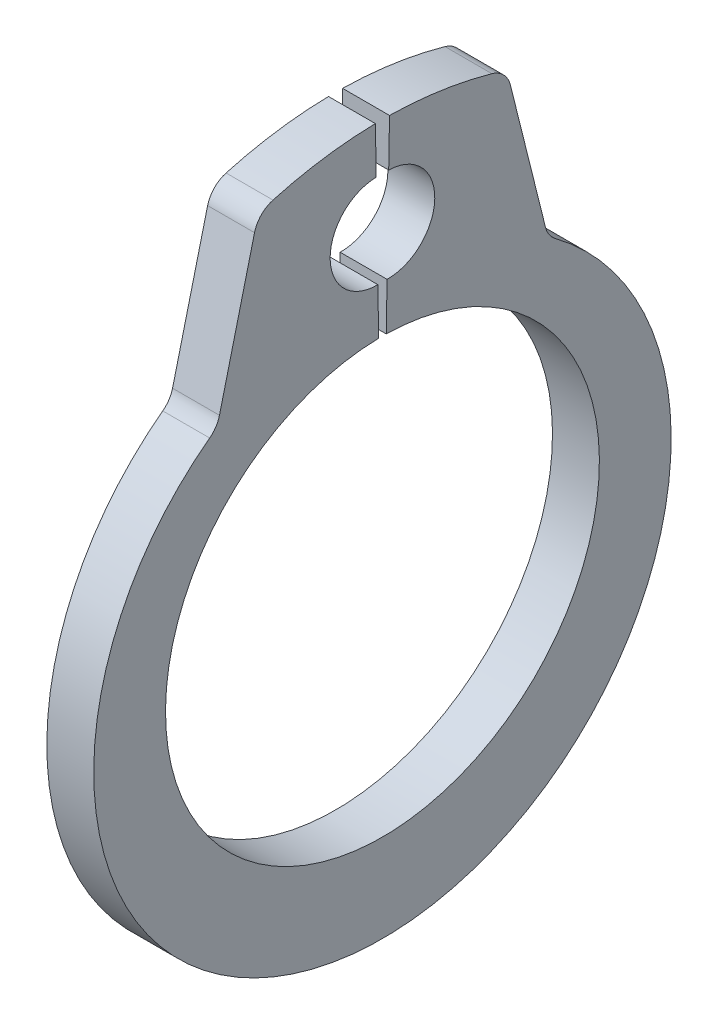
ISO-10303-21;
HEADER;
FILE_DESCRIPTION(('STEP AP214'),'2;1');
FILE_NAME('part.step','',(''),(''),'','','');
FILE_SCHEMA(('AUTOMOTIVE_DESIGN { 1 0 10303 214 1 1 1 1 }'));
ENDSEC;
DATA;
#1=APPLICATION_CONTEXT('core data for automotive mechanical design processes');
#2=APPLICATION_PROTOCOL_DEFINITION('international standard','automotive_design',2000,#1);
#3=PRODUCT_CONTEXT('',#1,'mechanical');
#4=PRODUCT('Part','Part','',(#3));
#5=PRODUCT_RELATED_PRODUCT_CATEGORY('part','',(#4));
#6=PRODUCT_DEFINITION_FORMATION('','',#4);
#7=PRODUCT_DEFINITION_CONTEXT('part definition',#1,'design');
#8=PRODUCT_DEFINITION('design','',#6,#7);
#9=PRODUCT_DEFINITION_SHAPE('','',#8);
#10=(LENGTH_UNIT() NAMED_UNIT(*) SI_UNIT(.MILLI.,.METRE.));
#11=(NAMED_UNIT(*) PLANE_ANGLE_UNIT() SI_UNIT($,.RADIAN.));
#12=(NAMED_UNIT(*) SI_UNIT($,.STERADIAN.) SOLID_ANGLE_UNIT());
#13=UNCERTAINTY_MEASURE_WITH_UNIT(LENGTH_MEASURE(1.E-05),#10,'distance_accuracy_value','');
#14=(GEOMETRIC_REPRESENTATION_CONTEXT(3) GLOBAL_UNCERTAINTY_ASSIGNED_CONTEXT((#13)) GLOBAL_UNIT_ASSIGNED_CONTEXT((#10,
#11,#12)) REPRESENTATION_CONTEXT('',''));
#15=CARTESIAN_POINT('',(0.,0.,0.));
#16=DIRECTION('',(0.,0.,1.));
#17=DIRECTION('',(1.,0.,0.));
#18=AXIS2_PLACEMENT_3D('',#15,#16,#17);
#19=CARTESIAN_POINT('',(0.4,0.,0.));
#20=DIRECTION('',(1.,0.,0.));
#21=DIRECTION('',(0.,0.,-1.));
#22=AXIS2_PLACEMENT_3D('',#19,#20,#21);
#23=PLANE('',#22);
#24=CARTESIAN_POINT('',(0.4,5.29919278432887,0.0924977541176028));
#25=DIRECTION('',(-1.,0.,0.));
#26=DIRECTION('',(0.,0.,1.));
#27=AXIS2_PLACEMENT_3D('',#24,#25,#26);
#28=CIRCLE('',#27,0.8);
#29=CARTESIAN_POINT('',(0.4,4.49931462820376,0.078535828967776));
#30=VERTEX_POINT('',#29);
#31=CARTESIAN_POINT('',(0.4,6.09907094045399,0.10645967926743));
#32=VERTEX_POINT('',#31);
#33=EDGE_CURVE('E203',#30,#32,#28,.T.);
#34=ORIENTED_EDGE('',*,*,#33,.T.);
#35=DIRECTION('',(0.,-0.999847695156391,-0.0174524064372836));
#36=VECTOR('',#35,1.);
#37=CARTESIAN_POINT('',(0.4,6.09907094045399,0.10645967926743));
#38=LINE('',#37,#36);
#39=CARTESIAN_POINT('',(0.4,6.8989490965791,0.120421604417256));
#40=VERTEX_POINT('',#39);
#41=EDGE_CURVE('E147',#32,#40,#38,.F.);
#42=ORIENTED_EDGE('',*,*,#41,.T.);
#43=CARTESIAN_POINT('',(0.4,0.,0.));
#44=DIRECTION('',(-1.,0.,0.));
#45=DIRECTION('',(0.,0.,1.));
#46=AXIS2_PLACEMENT_3D('',#43,#44,#45);
#47=CIRCLE('',#46,6.9);
#48=CARTESIAN_POINT('',(0.4,6.64266396102143,1.86681962196326));
#49=VERTEX_POINT('',#48);
#50=EDGE_CURVE('E150',#49,#40,#47,.T.);
#51=ORIENTED_EDGE('',*,*,#50,.F.);
#52=CARTESIAN_POINT('',(0.4,6.20944674617221,1.74507051618304));
#53=DIRECTION('',(-1.,0.,0.));
#54=DIRECTION('',(0.,0.,1.));
#55=AXIS2_PLACEMENT_3D('',#52,#53,#54);
#56=CIRCLE('',#55,0.45);
#57=CARTESIAN_POINT('',(0.4,6.31831159919206,2.18170359300724));
#58=VERTEX_POINT('',#57);
#59=EDGE_CURVE('E140',#58,#49,#56,.T.);
#60=ORIENTED_EDGE('',*,*,#59,.F.);
#61=DIRECTION('',(0.,0.970295726275997,-0.241921895599665));
#62=VECTOR('',#61,1.);
#63=CARTESIAN_POINT('',(0.4,6.56628693047853,2.11987639890321));
#64=LINE('',#63,#62);
#65=CARTESIAN_POINT('',(0.4,3.9198920595554,2.7796967468049));
#66=VERTEX_POINT('',#65);
#67=EDGE_CURVE('E136',#58,#66,#64,.F.);
#68=ORIENTED_EDGE('',*,*,#67,.T.);
#69=CARTESIAN_POINT('',(0.4,4.02875691257525,3.2163298236291));
#70=DIRECTION('',(-1.,0.,0.));
#71=DIRECTION('',(0.,0.,1.));
#72=AXIS2_PLACEMENT_3D('',#69,#70,#71);
#73=CIRCLE('',#72,0.45);
#74=CARTESIAN_POINT('',(0.4,3.66825913492506,2.94699480490842));
#75=VERTEX_POINT('',#74);
#76=EDGE_CURVE('E20',#66,#75,#73,.T.);
#77=ORIENTED_EDGE('',*,*,#76,.T.);
#78=CARTESIAN_POINT('',(0.4,-0.27621523369722,0.));
#79=DIRECTION('',(-1.,0.,0.));
#80=DIRECTION('',(0.,0.,1.));
#81=AXIS2_PLACEMENT_3D('',#78,#79,#80);
#82=CIRCLE('',#81,4.92378476630278);
#83=CARTESIAN_POINT('',(0.4,3.66825913492506,-2.94699480490842));
#84=VERTEX_POINT('',#83);
#85=EDGE_CURVE('E216',#84,#75,#82,.T.);
#86=ORIENTED_EDGE('',*,*,#85,.F.);
#87=CARTESIAN_POINT('',(0.4,4.02875691257525,-3.2163298236291));
#88=DIRECTION('',(-1.,0.,0.));
#89=DIRECTION('',(0.,0.,1.));
#90=AXIS2_PLACEMENT_3D('',#87,#88,#89);
#91=CIRCLE('',#90,0.45);
#92=CARTESIAN_POINT('',(0.4,3.9198920595554,-2.7796967468049));
#93=VERTEX_POINT('',#92);
#94=EDGE_CURVE('E214',#84,#93,#91,.T.);
#95=ORIENTED_EDGE('',*,*,#94,.T.);
#96=DIRECTION('',(0.,-0.970295726275997,-0.241921895599664));
#97=VECTOR('',#96,1.);
#98=CARTESIAN_POINT('',(0.4,6.56628693047853,-2.11987639890321));
#99=LINE('',#98,#97);
#100=CARTESIAN_POINT('',(0.4,6.31831159919206,-2.18170359300724));
#101=VERTEX_POINT('',#100);
#102=EDGE_CURVE('E166',#93,#101,#99,.F.);
#103=ORIENTED_EDGE('',*,*,#102,.T.);
#104=CARTESIAN_POINT('',(0.4,6.20944674617221,-1.74507051618304));
#105=DIRECTION('',(-1.,0.,0.));
#106=DIRECTION('',(0.,0.,1.));
#107=AXIS2_PLACEMENT_3D('',#104,#105,#106);
#108=CIRCLE('',#107,0.45);
#109=CARTESIAN_POINT('',(0.4,6.64266396102144,-1.86681962196326));
#110=VERTEX_POINT('',#109);
#111=EDGE_CURVE('E169',#110,#101,#108,.T.);
#112=ORIENTED_EDGE('',*,*,#111,.F.);
#113=CARTESIAN_POINT('',(0.4,0.,0.));
#114=DIRECTION('',(-1.,0.,0.));
#115=DIRECTION('',(0.,0.,1.));
#116=AXIS2_PLACEMENT_3D('',#113,#114,#115);
#117=CIRCLE('',#116,6.9);
#118=CARTESIAN_POINT('',(0.4,6.8989490965791,-0.120421604417258));
#119=VERTEX_POINT('',#118);
#120=EDGE_CURVE('E209',#119,#110,#117,.T.);
#121=ORIENTED_EDGE('',*,*,#120,.F.);
#122=DIRECTION('',(0.,0.999847695156391,-0.0174524064372838));
#123=VECTOR('',#122,1.);
#124=CARTESIAN_POINT('',(0.4,6.09907094045399,-0.106459679267431));
#125=LINE('',#124,#123);
#126=CARTESIAN_POINT('',(0.4,6.09907094045399,-0.106459679267431));
#127=VERTEX_POINT('',#126);
#128=EDGE_CURVE('E162',#119,#127,#125,.F.);
#129=ORIENTED_EDGE('',*,*,#128,.T.);
#130=CARTESIAN_POINT('',(0.4,5.29919278432888,-0.092497754117604));
#131=DIRECTION('',(-1.,0.,0.));
#132=DIRECTION('',(0.,0.,1.));
#133=AXIS2_PLACEMENT_3D('',#130,#131,#132);
#134=CIRCLE('',#133,0.8);
#135=CARTESIAN_POINT('',(0.4,4.49931462820376,-0.078535828967777));
#136=VERTEX_POINT('',#135);
#137=EDGE_CURVE('E207',#127,#136,#134,.T.);
#138=ORIENTED_EDGE('',*,*,#137,.T.);
#139=DIRECTION('',(0.,0.999847695156391,-0.0174524064372848));
#140=VECTOR('',#139,1.);
#141=CARTESIAN_POINT('',(0.4,3.69943647207865,-0.0645739038179491));
#142=LINE('',#141,#140);
#143=CARTESIAN_POINT('',(0.4,3.69943647207865,-0.064573903817949));
#144=VERTEX_POINT('',#143);
#145=EDGE_CURVE('E157',#136,#144,#142,.F.);
#146=ORIENTED_EDGE('',*,*,#145,.T.);
#147=CARTESIAN_POINT('',(0.4,0.,0.));
#148=DIRECTION('',(-1.,0.,0.));
#149=DIRECTION('',(0.,0.,1.));
#150=AXIS2_PLACEMENT_3D('',#147,#148,#149);
#151=CIRCLE('',#150,3.7);
#152=CARTESIAN_POINT('',(0.4,3.69943647207865,0.0645739038179491));
#153=VERTEX_POINT('',#152);
#154=EDGE_CURVE('E205',#144,#153,#151,.T.);
#155=ORIENTED_EDGE('',*,*,#154,.T.);
#156=DIRECTION('',(0.,-0.999847695156391,-0.0174524064372836));
#157=VECTOR('',#156,1.);
#158=CARTESIAN_POINT('',(0.4,4.49931462820376,0.078535828967776));
#159=LINE('',#158,#157);
#160=EDGE_CURVE('E152',#153,#30,#159,.F.);
#161=ORIENTED_EDGE('',*,*,#160,.T.);
#162=EDGE_LOOP('',(#34,#42,#51,#60,#68,#77,#86,#95,#103,#112,#121,#129,#138,#146,#155,#161));
#163=FACE_BOUND('',#162,.T.);
#164=ADVANCED_FACE('F17',(#163),#23,.T.);
#165=CARTESIAN_POINT('',(0.4,4.02875691257525,3.2163298236291));
#166=DIRECTION('',(-1.,0.,0.));
#167=DIRECTION('',(0.,0.,1.));
#168=AXIS2_PLACEMENT_3D('',#165,#166,#167);
#169=CYLINDRICAL_SURFACE('',#168,0.45);
#170=DIRECTION('',(1.,0.,0.));
#171=VECTOR('',#170,1.);
#172=CARTESIAN_POINT('',(0.4,3.9198920595554,2.7796967468049));
#173=LINE('',#172,#171);
#174=CARTESIAN_POINT('',(-0.4,3.9198920595554,2.7796967468049));
#175=VERTEX_POINT('',#174);
#176=EDGE_CURVE('E131',#66,#175,#173,.F.);
#177=ORIENTED_EDGE('',*,*,#176,.T.);
#178=CARTESIAN_POINT('',(-0.4,4.02875691257525,3.2163298236291));
#179=DIRECTION('',(-1.,0.,0.));
#180=DIRECTION('',(0.,0.,1.));
#181=AXIS2_PLACEMENT_3D('',#178,#179,#180);
#182=CIRCLE('',#181,0.45);
#183=CARTESIAN_POINT('',(-0.4,3.66825913492506,2.94699480490842));
#184=VERTEX_POINT('',#183);
#185=EDGE_CURVE('E137',#175,#184,#182,.T.);
#186=ORIENTED_EDGE('',*,*,#185,.T.);
#187=DIRECTION('',(-1.,0.,0.));
#188=VECTOR('',#187,1.);
#189=CARTESIAN_POINT('',(0.4,3.66825913492506,2.94699480490842));
#190=LINE('',#189,#188);
#191=EDGE_CURVE('E132',#75,#184,#190,.T.);
#192=ORIENTED_EDGE('',*,*,#191,.F.);
#193=ORIENTED_EDGE('',*,*,#76,.F.);
#194=EDGE_LOOP('',(#177,#186,#192,#193));
#195=FACE_BOUND('',#194,.T.);
#196=ADVANCED_FACE('F129',(#195),#169,.F.);
#197=CARTESIAN_POINT('',(0.4,-0.27621523369722,0.));
#198=DIRECTION('',(-1.,0.,0.));
#199=DIRECTION('',(0.,0.,1.));
#200=AXIS2_PLACEMENT_3D('',#197,#198,#199);
#201=CYLINDRICAL_SURFACE('',#200,4.92378476630278);
#202=CARTESIAN_POINT('',(-0.4,-0.27621523369722,0.));
#203=DIRECTION('',(-1.,0.,0.));
#204=DIRECTION('',(0.,0.,1.));
#205=AXIS2_PLACEMENT_3D('',#202,#203,#204);
#206=CIRCLE('',#205,4.92378476630278);
#207=CARTESIAN_POINT('',(-0.4,3.66825913492506,-2.94699480490842));
#208=VERTEX_POINT('',#207);
#209=EDGE_CURVE('E197',#184,#208,#206,.F.);
#210=ORIENTED_EDGE('',*,*,#209,.T.);
#211=DIRECTION('',(-1.,0.,0.));
#212=VECTOR('',#211,1.);
#213=CARTESIAN_POINT('',(0.4,3.66825913492506,-2.94699480490842));
#214=LINE('',#213,#212);
#215=EDGE_CURVE('E215',#208,#84,#214,.F.);
#216=ORIENTED_EDGE('',*,*,#215,.T.);
#217=ORIENTED_EDGE('',*,*,#85,.T.);
#218=ORIENTED_EDGE('',*,*,#191,.T.);
#219=EDGE_LOOP('',(#210,#216,#217,#218));
#220=FACE_BOUND('',#219,.T.);
#221=ADVANCED_FACE('F221',(#220),#201,.T.);
#222=CARTESIAN_POINT('',(0.4,4.02875691257525,-3.2163298236291));
#223=DIRECTION('',(-1.,0.,0.));
#224=DIRECTION('',(0.,0.,1.));
#225=AXIS2_PLACEMENT_3D('',#222,#223,#224);
#226=CYLINDRICAL_SURFACE('',#225,0.45);
#227=ORIENTED_EDGE('',*,*,#215,.F.);
#228=CARTESIAN_POINT('',(-0.4,4.02875691257525,-3.2163298236291));
#229=DIRECTION('',(-1.,0.,0.));
#230=DIRECTION('',(0.,0.,1.));
#231=AXIS2_PLACEMENT_3D('',#228,#229,#230);
#232=CIRCLE('',#231,0.45);
#233=CARTESIAN_POINT('',(-0.4,3.9198920595554,-2.7796967468049));
#234=VERTEX_POINT('',#233);
#235=EDGE_CURVE('E194',#208,#234,#232,.T.);
#236=ORIENTED_EDGE('',*,*,#235,.T.);
#237=DIRECTION('',(1.,0.,0.));
#238=VECTOR('',#237,1.);
#239=CARTESIAN_POINT('',(0.4,3.9198920595554,-2.7796967468049));
#240=LINE('',#239,#238);
#241=EDGE_CURVE('E170',#234,#93,#240,.T.);
#242=ORIENTED_EDGE('',*,*,#241,.T.);
#243=ORIENTED_EDGE('',*,*,#94,.F.);
#244=EDGE_LOOP('',(#227,#236,#242,#243));
#245=FACE_BOUND('',#244,.T.);
#246=ADVANCED_FACE('F232',(#245),#226,.F.);
#247=CARTESIAN_POINT('',(0.4,6.56628693047853,-2.11987639890321));
#248=DIRECTION('',(0.,-0.241921895599664,0.970295726275997));
#249=DIRECTION('',(0.,-0.970295726275997,-0.241921895599664));
#250=AXIS2_PLACEMENT_3D('',#247,#248,#249);
#251=PLANE('',#250);
#252=DIRECTION('',(-1.,0.,0.));
#253=VECTOR('',#252,1.);
#254=CARTESIAN_POINT('',(0.4,6.31831159919206,-2.18170359300724));
#255=LINE('',#254,#253);
#256=CARTESIAN_POINT('',(-0.4,6.31831159919206,-2.18170359300724));
#257=VERTEX_POINT('',#256);
#258=EDGE_CURVE('E212',#101,#257,#255,.T.);
#259=ORIENTED_EDGE('',*,*,#258,.F.);
#260=ORIENTED_EDGE('',*,*,#102,.F.);
#261=ORIENTED_EDGE('',*,*,#241,.F.);
#262=DIRECTION('',(0.,0.970295726275997,0.241921895599664));
#263=VECTOR('',#262,1.);
#264=CARTESIAN_POINT('',(-0.4,3.9198920595554,-2.7796967468049));
#265=LINE('',#264,#263);
#266=EDGE_CURVE('E193',#234,#257,#265,.T.);
#267=ORIENTED_EDGE('',*,*,#266,.T.);
#268=EDGE_LOOP('',(#259,#260,#261,#267));
#269=FACE_BOUND('',#268,.T.);
#270=ADVANCED_FACE('F238',(#269),#251,.F.);
#271=CARTESIAN_POINT('',(0.4,6.20944674617221,-1.74507051618304));
#272=DIRECTION('',(-1.,0.,0.));
#273=DIRECTION('',(0.,0.,1.));
#274=AXIS2_PLACEMENT_3D('',#271,#272,#273);
#275=CYLINDRICAL_SURFACE('',#274,0.45);
#276=CARTESIAN_POINT('',(-0.4,6.20944674617221,-1.74507051618304));
#277=DIRECTION('',(-1.,0.,0.));
#278=DIRECTION('',(0.,0.,1.));
#279=AXIS2_PLACEMENT_3D('',#276,#277,#278);
#280=CIRCLE('',#279,0.45);
#281=CARTESIAN_POINT('',(-0.4,6.64266396102144,-1.86681962196326));
#282=VERTEX_POINT('',#281);
#283=EDGE_CURVE('E190',#257,#282,#280,.F.);
#284=ORIENTED_EDGE('',*,*,#283,.T.);
#285=DIRECTION('',(-1.,0.,0.));
#286=VECTOR('',#285,1.);
#287=CARTESIAN_POINT('',(0.4,6.64266396102144,-1.86681962196326));
#288=LINE('',#287,#286);
#289=EDGE_CURVE('E211',#110,#282,#288,.T.);
#290=ORIENTED_EDGE('',*,*,#289,.F.);
#291=ORIENTED_EDGE('',*,*,#111,.T.);
#292=ORIENTED_EDGE('',*,*,#258,.T.);
#293=EDGE_LOOP('',(#284,#290,#291,#292));
#294=FACE_BOUND('',#293,.T.);
#295=ADVANCED_FACE('F304',(#294),#275,.T.);
#296=CARTESIAN_POINT('',(0.4,0.,0.));
#297=DIRECTION('',(-1.,0.,0.));
#298=DIRECTION('',(0.,0.,1.));
#299=AXIS2_PLACEMENT_3D('',#296,#297,#298);
#300=CYLINDRICAL_SURFACE('',#299,6.9);
#301=CARTESIAN_POINT('',(-0.4,0.,0.));
#302=DIRECTION('',(-1.,0.,0.));
#303=DIRECTION('',(0.,0.,1.));
#304=AXIS2_PLACEMENT_3D('',#301,#302,#303);
#305=CIRCLE('',#304,6.9);
#306=CARTESIAN_POINT('',(-0.4,6.8989490965791,-0.120421604417258));
#307=VERTEX_POINT('',#306);
#308=EDGE_CURVE('E187',#282,#307,#305,.F.);
#309=ORIENTED_EDGE('',*,*,#308,.T.);
#310=DIRECTION('',(1.,0.,0.));
#311=VECTOR('',#310,1.);
#312=CARTESIAN_POINT('',(0.4,6.8989490965791,-0.120421604417258));
#313=LINE('',#312,#311);
#314=EDGE_CURVE('E165',#307,#119,#313,.T.);
#315=ORIENTED_EDGE('',*,*,#314,.T.);
#316=ORIENTED_EDGE('',*,*,#120,.T.);
#317=ORIENTED_EDGE('',*,*,#289,.T.);
#318=EDGE_LOOP('',(#309,#315,#316,#317));
#319=FACE_BOUND('',#318,.T.);
#320=ADVANCED_FACE('F302',(#319),#300,.T.);
#321=CARTESIAN_POINT('',(0.4,6.09907094045399,-0.106459679267431));
#322=DIRECTION('',(0.,-0.0174524064372838,-0.999847695156391));
#323=DIRECTION('',(0.,0.999847695156391,-0.0174524064372838));
#324=AXIS2_PLACEMENT_3D('',#321,#322,#323);
#325=PLANE('',#324);
#326=DIRECTION('',(-1.,0.,0.));
#327=VECTOR('',#326,1.);
#328=CARTESIAN_POINT('',(0.4,6.09907094045399,-0.106459679267431));
#329=LINE('',#328,#327);
#330=CARTESIAN_POINT('',(-0.4,6.09907094045399,-0.106459679267431));
#331=VERTEX_POINT('',#330);
#332=EDGE_CURVE('E164',#331,#127,#329,.F.);
#333=ORIENTED_EDGE('',*,*,#332,.T.);
#334=ORIENTED_EDGE('',*,*,#128,.F.);
#335=ORIENTED_EDGE('',*,*,#314,.F.);
#336=DIRECTION('',(0.,-0.999847695156391,0.0174524064372831));
#337=VECTOR('',#336,1.);
#338=CARTESIAN_POINT('',(-0.4,6.8989490965791,-0.120421604417258));
#339=LINE('',#338,#337);
#340=EDGE_CURVE('E186',#307,#331,#339,.T.);
#341=ORIENTED_EDGE('',*,*,#340,.T.);
#342=EDGE_LOOP('',(#333,#334,#335,#341));
#343=FACE_BOUND('',#342,.T.);
#344=ADVANCED_FACE('F299',(#343),#325,.F.);
#345=CARTESIAN_POINT('',(0.4,5.29919278432888,-0.092497754117604));
#346=DIRECTION('',(-1.,0.,0.));
#347=DIRECTION('',(0.,0.,1.));
#348=AXIS2_PLACEMENT_3D('',#345,#346,#347);
#349=CYLINDRICAL_SURFACE('',#348,0.8);
#350=DIRECTION('',(1.,0.,0.));
#351=VECTOR('',#350,1.);
#352=CARTESIAN_POINT('',(0.4,4.49931462820376,-0.078535828967777));
#353=LINE('',#352,#351);
#354=CARTESIAN_POINT('',(-0.4,4.49931462820376,-0.0785358289677773));
#355=VERTEX_POINT('',#354);
#356=EDGE_CURVE('E161',#355,#136,#353,.T.);
#357=ORIENTED_EDGE('',*,*,#356,.T.);
#358=ORIENTED_EDGE('',*,*,#137,.F.);
#359=ORIENTED_EDGE('',*,*,#332,.F.);
#360=CARTESIAN_POINT('',(-0.4,5.29919278432888,-0.092497754117604));
#361=DIRECTION('',(-1.,0.,0.));
#362=DIRECTION('',(0.,0.,1.));
#363=AXIS2_PLACEMENT_3D('',#360,#361,#362);
#364=CIRCLE('',#363,0.8);
#365=EDGE_CURVE('E183',#331,#355,#364,.T.);
#366=ORIENTED_EDGE('',*,*,#365,.T.);
#367=EDGE_LOOP('',(#357,#358,#359,#366));
#368=FACE_BOUND('',#367,.T.);
#369=ADVANCED_FACE('F295',(#368),#349,.F.);
#370=CARTESIAN_POINT('',(0.4,3.69943647207865,-0.0645739038179491));
#371=DIRECTION('',(0.,-0.0174524064372848,-0.999847695156391));
#372=DIRECTION('',(0.,0.999847695156391,-0.0174524064372848));
#373=AXIS2_PLACEMENT_3D('',#370,#371,#372);
#374=PLANE('',#373);
#375=DIRECTION('',(-1.,0.,0.));
#376=VECTOR('',#375,1.);
#377=CARTESIAN_POINT('',(0.4,3.69943647207865,-0.0645739038179489));
#378=LINE('',#377,#376);
#379=CARTESIAN_POINT('',(-0.4,3.69943647207865,-0.064573903817949));
#380=VERTEX_POINT('',#379);
#381=EDGE_CURVE('E160',#380,#144,#378,.F.);
#382=ORIENTED_EDGE('',*,*,#381,.T.);
#383=ORIENTED_EDGE('',*,*,#145,.F.);
#384=ORIENTED_EDGE('',*,*,#356,.F.);
#385=DIRECTION('',(0.,-0.999847695156391,0.0174524064372854));
#386=VECTOR('',#385,1.);
#387=CARTESIAN_POINT('',(-0.4,4.49931462820376,-0.0785358289677775));
#388=LINE('',#387,#386);
#389=EDGE_CURVE('E182',#355,#380,#388,.T.);
#390=ORIENTED_EDGE('',*,*,#389,.T.);
#391=EDGE_LOOP('',(#382,#383,#384,#390));
#392=FACE_BOUND('',#391,.T.);
#393=ADVANCED_FACE('F291',(#392),#374,.F.);
#394=CARTESIAN_POINT('',(0.4,0.,0.));
#395=DIRECTION('',(-1.,0.,0.));
#396=DIRECTION('',(0.,0.,1.));
#397=AXIS2_PLACEMENT_3D('',#394,#395,#396);
#398=CYLINDRICAL_SURFACE('',#397,3.7);
#399=ORIENTED_EDGE('',*,*,#154,.F.);
#400=ORIENTED_EDGE('',*,*,#381,.F.);
#401=CARTESIAN_POINT('',(-0.4,0.,0.));
#402=DIRECTION('',(-1.,0.,0.));
#403=DIRECTION('',(0.,0.,1.));
#404=AXIS2_PLACEMENT_3D('',#401,#402,#403);
#405=CIRCLE('',#404,3.7);
#406=CARTESIAN_POINT('',(-0.4,3.69943647207865,0.0645739038179491));
#407=VERTEX_POINT('',#406);
#408=EDGE_CURVE('E180',#380,#407,#405,.T.);
#409=ORIENTED_EDGE('',*,*,#408,.T.);
#410=DIRECTION('',(1.,0.,0.));
#411=VECTOR('',#410,1.);
#412=CARTESIAN_POINT('',(0.4,3.69943647207865,0.0645739038179491));
#413=LINE('',#412,#411);
#414=EDGE_CURVE('E156',#407,#153,#413,.T.);
#415=ORIENTED_EDGE('',*,*,#414,.T.);
#416=EDGE_LOOP('',(#399,#400,#409,#415));
#417=FACE_BOUND('',#416,.T.);
#418=ADVANCED_FACE('F305',(#417),#398,.F.);
#419=CARTESIAN_POINT('',(0.4,4.49931462820376,0.078535828967776));
#420=DIRECTION('',(0.,-0.0174524064372836,0.999847695156391));
#421=DIRECTION('',(0.,-0.999847695156391,-0.0174524064372836));
#422=AXIS2_PLACEMENT_3D('',#419,#420,#421);
#423=PLANE('',#422);
#424=DIRECTION('',(-1.,0.,0.));
#425=VECTOR('',#424,1.);
#426=CARTESIAN_POINT('',(0.4,4.49931462820376,0.078535828967776));
#427=LINE('',#426,#425);
#428=CARTESIAN_POINT('',(-0.4,4.49931462820376,0.078535828967776));
#429=VERTEX_POINT('',#428);
#430=EDGE_CURVE('E155',#429,#30,#427,.F.);
#431=ORIENTED_EDGE('',*,*,#430,.T.);
#432=ORIENTED_EDGE('',*,*,#160,.F.);
#433=ORIENTED_EDGE('',*,*,#414,.F.);
#434=DIRECTION('',(0.,0.999847695156391,0.0174524064372835));
#435=VECTOR('',#434,1.);
#436=CARTESIAN_POINT('',(-0.4,3.69943647207865,0.0645739038179491));
#437=LINE('',#436,#435);
#438=EDGE_CURVE('E179',#407,#429,#437,.T.);
#439=ORIENTED_EDGE('',*,*,#438,.T.);
#440=EDGE_LOOP('',(#431,#432,#433,#439));
#441=FACE_BOUND('',#440,.T.);
#442=ADVANCED_FACE('F284',(#441),#423,.F.);
#443=CARTESIAN_POINT('',(0.4,5.29919278432887,0.0924977541176028));
#444=DIRECTION('',(-1.,0.,0.));
#445=DIRECTION('',(0.,0.,1.));
#446=AXIS2_PLACEMENT_3D('',#443,#444,#445);
#447=CYLINDRICAL_SURFACE('',#446,0.8);
#448=ORIENTED_EDGE('',*,*,#33,.F.);
#449=ORIENTED_EDGE('',*,*,#430,.F.);
#450=CARTESIAN_POINT('',(-0.4,5.29919278432887,0.0924977541176028));
#451=DIRECTION('',(-1.,0.,0.));
#452=DIRECTION('',(0.,0.,1.));
#453=AXIS2_PLACEMENT_3D('',#450,#451,#452);
#454=CIRCLE('',#453,0.8);
#455=CARTESIAN_POINT('',(-0.4,6.09907094045399,0.10645967926743));
#456=VERTEX_POINT('',#455);
#457=EDGE_CURVE('E177',#429,#456,#454,.T.);
#458=ORIENTED_EDGE('',*,*,#457,.T.);
#459=DIRECTION('',(1.,0.,0.));
#460=VECTOR('',#459,1.);
#461=CARTESIAN_POINT('',(0.4,6.09907094045399,0.10645967926743));
#462=LINE('',#461,#460);
#463=EDGE_CURVE('E151',#456,#32,#462,.T.);
#464=ORIENTED_EDGE('',*,*,#463,.T.);
#465=EDGE_LOOP('',(#448,#449,#458,#464));
#466=FACE_BOUND('',#465,.T.);
#467=ADVANCED_FACE('F281',(#466),#447,.F.);
#468=CARTESIAN_POINT('',(0.4,6.09907094045399,0.10645967926743));
#469=DIRECTION('',(0.,-0.0174524064372836,0.999847695156391));
#470=DIRECTION('',(0.,-0.999847695156391,-0.0174524064372836));
#471=AXIS2_PLACEMENT_3D('',#468,#469,#470);
#472=PLANE('',#471);
#473=DIRECTION('',(-1.,0.,0.));
#474=VECTOR('',#473,1.);
#475=CARTESIAN_POINT('',(0.4,6.8989490965791,0.120421604417256));
#476=LINE('',#475,#474);
#477=CARTESIAN_POINT('',(-0.4,6.8989490965791,0.120421604417256));
#478=VERTEX_POINT('',#477);
#479=EDGE_CURVE('E201',#40,#478,#476,.T.);
#480=ORIENTED_EDGE('',*,*,#479,.F.);
#481=ORIENTED_EDGE('',*,*,#41,.F.);
#482=ORIENTED_EDGE('',*,*,#463,.F.);
#483=DIRECTION('',(0.,0.999847695156391,0.0174524064372837));
#484=VECTOR('',#483,1.);
#485=CARTESIAN_POINT('',(-0.4,6.09907094045399,0.10645967926743));
#486=LINE('',#485,#484);
#487=EDGE_CURVE('E176',#456,#478,#486,.T.);
#488=ORIENTED_EDGE('',*,*,#487,.T.);
#489=EDGE_LOOP('',(#480,#481,#482,#488));
#490=FACE_BOUND('',#489,.T.);
#491=ADVANCED_FACE('F272',(#490),#472,.F.);
#492=CARTESIAN_POINT('',(0.4,0.,0.));
#493=DIRECTION('',(-1.,0.,0.));
#494=DIRECTION('',(0.,0.,1.));
#495=AXIS2_PLACEMENT_3D('',#492,#493,#494);
#496=CYLINDRICAL_SURFACE('',#495,6.9);
#497=ORIENTED_EDGE('',*,*,#50,.T.);
#498=ORIENTED_EDGE('',*,*,#479,.T.);
#499=CARTESIAN_POINT('',(-0.4,0.,0.));
#500=DIRECTION('',(-1.,0.,0.));
#501=DIRECTION('',(0.,0.,1.));
#502=AXIS2_PLACEMENT_3D('',#499,#500,#501);
#503=CIRCLE('',#502,6.9);
#504=CARTESIAN_POINT('',(-0.4,6.64266396102143,1.86681962196326));
#505=VERTEX_POINT('',#504);
#506=EDGE_CURVE('E173',#478,#505,#503,.F.);
#507=ORIENTED_EDGE('',*,*,#506,.T.);
#508=DIRECTION('',(-1.,0.,0.));
#509=VECTOR('',#508,1.);
#510=CARTESIAN_POINT('',(0.4,6.64266396102143,1.86681962196326));
#511=LINE('',#510,#509);
#512=EDGE_CURVE('E142',#49,#505,#511,.T.);
#513=ORIENTED_EDGE('',*,*,#512,.F.);
#514=EDGE_LOOP('',(#497,#498,#507,#513));
#515=FACE_BOUND('',#514,.T.);
#516=ADVANCED_FACE('F279',(#515),#496,.T.);
#517=CARTESIAN_POINT('',(0.4,6.20944674617221,1.74507051618304));
#518=DIRECTION('',(-1.,0.,0.));
#519=DIRECTION('',(0.,0.,1.));
#520=AXIS2_PLACEMENT_3D('',#517,#518,#519);
#521=CYLINDRICAL_SURFACE('',#520,0.45);
#522=CARTESIAN_POINT('',(-0.4,6.20944674617221,1.74507051618304));
#523=DIRECTION('',(-1.,0.,0.));
#524=DIRECTION('',(0.,0.,1.));
#525=AXIS2_PLACEMENT_3D('',#522,#523,#524);
#526=CIRCLE('',#525,0.45);
#527=CARTESIAN_POINT('',(-0.4,6.31831159919206,2.18170359300724));
#528=VERTEX_POINT('',#527);
#529=EDGE_CURVE('E26',#505,#528,#526,.F.);
#530=ORIENTED_EDGE('',*,*,#529,.T.);
#531=DIRECTION('',(1.,0.,0.));
#532=VECTOR('',#531,1.);
#533=CARTESIAN_POINT('',(0.4,6.31831159919206,2.18170359300724));
#534=LINE('',#533,#532);
#535=EDGE_CURVE('E34',#528,#58,#534,.T.);
#536=ORIENTED_EDGE('',*,*,#535,.T.);
#537=ORIENTED_EDGE('',*,*,#59,.T.);
#538=ORIENTED_EDGE('',*,*,#512,.T.);
#539=EDGE_LOOP('',(#530,#536,#537,#538));
#540=FACE_BOUND('',#539,.T.);
#541=ADVANCED_FACE('F320',(#540),#521,.T.);
#542=CARTESIAN_POINT('',(0.4,6.56628693047853,2.11987639890321));
#543=DIRECTION('',(0.,-0.241921895599665,-0.970295726275997));
#544=DIRECTION('',(0.,0.970295726275997,-0.241921895599665));
#545=AXIS2_PLACEMENT_3D('',#542,#543,#544);
#546=PLANE('',#545);
#547=ORIENTED_EDGE('',*,*,#176,.F.);
#548=ORIENTED_EDGE('',*,*,#67,.F.);
#549=ORIENTED_EDGE('',*,*,#535,.F.);
#550=DIRECTION('',(0.,-0.970295726275997,0.241921895599665));
#551=VECTOR('',#550,1.);
#552=CARTESIAN_POINT('',(-0.4,6.31831159919206,2.18170359300724));
#553=LINE('',#552,#551);
#554=EDGE_CURVE('E11',#528,#175,#553,.T.);
#555=ORIENTED_EDGE('',*,*,#554,.T.);
#556=EDGE_LOOP('',(#547,#548,#549,#555));
#557=FACE_BOUND('',#556,.T.);
#558=ADVANCED_FACE('F135',(#557),#546,.F.);
#559=CARTESIAN_POINT('',(-0.4,0.,0.));
#560=DIRECTION('',(1.,0.,0.));
#561=DIRECTION('',(0.,0.,-1.));
#562=AXIS2_PLACEMENT_3D('',#559,#560,#561);
#563=PLANE('',#562);
#564=ORIENTED_EDGE('',*,*,#529,.F.);
#565=ORIENTED_EDGE('',*,*,#506,.F.);
#566=ORIENTED_EDGE('',*,*,#487,.F.);
#567=ORIENTED_EDGE('',*,*,#457,.F.);
#568=ORIENTED_EDGE('',*,*,#438,.F.);
#569=ORIENTED_EDGE('',*,*,#408,.F.);
#570=ORIENTED_EDGE('',*,*,#389,.F.);
#571=ORIENTED_EDGE('',*,*,#365,.F.);
#572=ORIENTED_EDGE('',*,*,#340,.F.);
#573=ORIENTED_EDGE('',*,*,#308,.F.);
#574=ORIENTED_EDGE('',*,*,#283,.F.);
#575=ORIENTED_EDGE('',*,*,#266,.F.);
#576=ORIENTED_EDGE('',*,*,#235,.F.);
#577=ORIENTED_EDGE('',*,*,#209,.F.);
#578=ORIENTED_EDGE('',*,*,#185,.F.);
#579=ORIENTED_EDGE('',*,*,#554,.F.);
#580=EDGE_LOOP('',(#564,#565,#566,#567,#568,#569,#570,#571,#572,#573,#574,#575,#576,#577,#578,#579));
#581=FACE_BOUND('',#580,.T.);
#582=ADVANCED_FACE('F226',(#581),#563,.F.);
#583=CLOSED_SHELL('',(#164,#196,#221,#246,#270,#295,#320,#344,#369,#393,#418,#442,#467,#491,
#516,#541,#558,#582));
#584=MANIFOLD_SOLID_BREP('B1',#583);
#585=ADVANCED_BREP_SHAPE_REPRESENTATION('',(#18,#584),#14);
#586=SHAPE_DEFINITION_REPRESENTATION(#9,#585);
ENDSEC;
END-ISO-10303-21;
